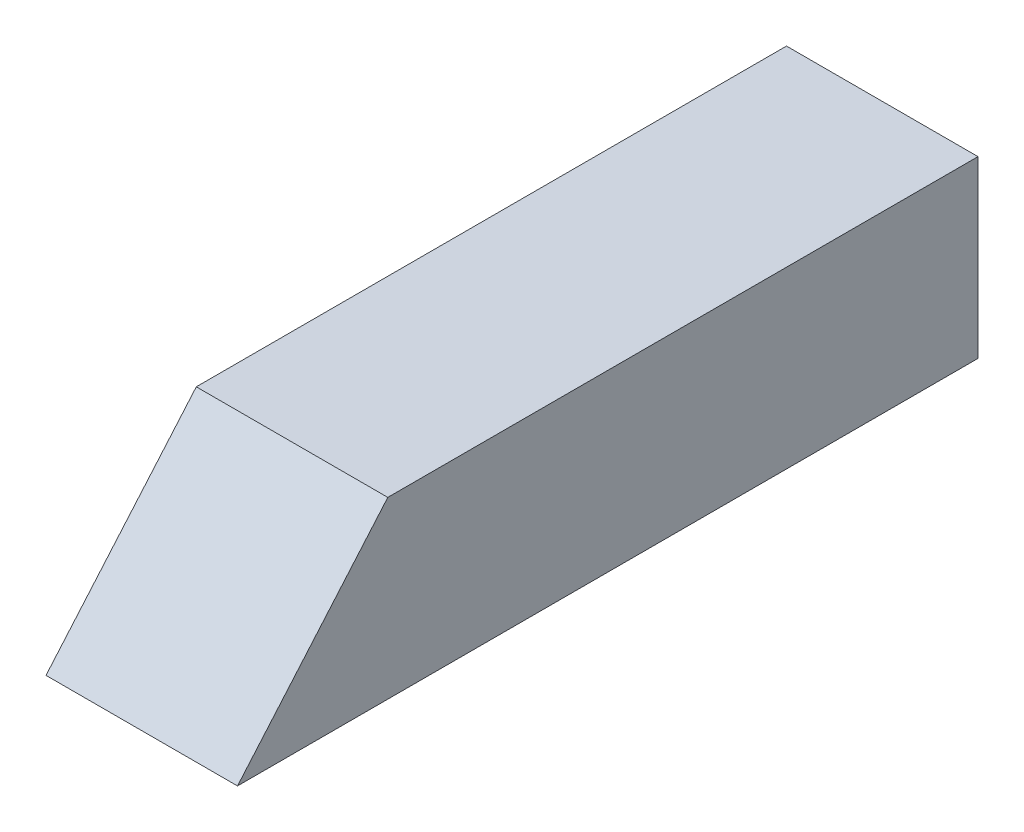
ISO-10303-21;
HEADER;
FILE_DESCRIPTION(('STEP AP214'),'2;1');
FILE_NAME('part.step','',(''),(''),'','','');
FILE_SCHEMA(('AUTOMOTIVE_DESIGN { 1 0 10303 214 1 1 1 1 }'));
ENDSEC;
DATA;
#1=APPLICATION_CONTEXT('core data for automotive mechanical design processes');
#2=APPLICATION_PROTOCOL_DEFINITION('international standard','automotive_design',2000,#1);
#3=PRODUCT_CONTEXT('',#1,'mechanical');
#4=PRODUCT('Part','Part','',(#3));
#5=PRODUCT_RELATED_PRODUCT_CATEGORY('part','',(#4));
#6=PRODUCT_DEFINITION_FORMATION('','',#4);
#7=PRODUCT_DEFINITION_CONTEXT('part definition',#1,'design');
#8=PRODUCT_DEFINITION('design','',#6,#7);
#9=PRODUCT_DEFINITION_SHAPE('','',#8);
#10=(LENGTH_UNIT() NAMED_UNIT(*) SI_UNIT(.MILLI.,.METRE.));
#11=(NAMED_UNIT(*) PLANE_ANGLE_UNIT() SI_UNIT($,.RADIAN.));
#12=(NAMED_UNIT(*) SI_UNIT($,.STERADIAN.) SOLID_ANGLE_UNIT());
#13=UNCERTAINTY_MEASURE_WITH_UNIT(LENGTH_MEASURE(1.E-05),#10,'distance_accuracy_value','');
#14=(GEOMETRIC_REPRESENTATION_CONTEXT(3) GLOBAL_UNCERTAINTY_ASSIGNED_CONTEXT((#13)) GLOBAL_UNIT_ASSIGNED_CONTEXT((#10,
#11,#12)) REPRESENTATION_CONTEXT('',''));
#15=CARTESIAN_POINT('',(0.,0.,0.));
#16=DIRECTION('',(0.,0.,1.));
#17=DIRECTION('',(1.,0.,0.));
#18=AXIS2_PLACEMENT_3D('',#15,#16,#17);
#19=CARTESIAN_POINT('',(0.,0.,170.));
#20=DIRECTION('',(1.,0.,0.));
#21=DIRECTION('',(0.,0.,-1.));
#22=AXIS2_PLACEMENT_3D('',#19,#20,#21);
#23=PLANE('',#22);
#24=DIRECTION('',(0.,0.,-1.));
#25=VECTOR('',#24,1.);
#26=CARTESIAN_POINT('',(0.,-40.1241169027451,170.));
#27=LINE('',#26,#25);
#28=CARTESIAN_POINT('',(0.,-40.1241169027451,170.));
#29=VERTEX_POINT('',#28);
#30=CARTESIAN_POINT('',(0.,-40.1241169027451,0.));
#31=VERTEX_POINT('',#30);
#32=EDGE_CURVE('E11',#29,#31,#27,.T.);
#33=ORIENTED_EDGE('',*,*,#32,.F.);
#34=DIRECTION('',(0.,0.758233405054984,-0.651983207957632));
#35=VECTOR('',#34,1.);
#36=CARTESIAN_POINT('',(0.,-40.1241169027451,170.));
#37=LINE('',#36,#35);
#38=CARTESIAN_POINT('',(0.,0.,135.498420037532));
#39=VERTEX_POINT('',#38);
#40=EDGE_CURVE('E48',#29,#39,#37,.T.);
#41=ORIENTED_EDGE('',*,*,#40,.T.);
#42=DIRECTION('',(0.,0.,-1.));
#43=VECTOR('',#42,1.);
#44=CARTESIAN_POINT('',(0.,0.,170.));
#45=LINE('',#44,#43);
#46=CARTESIAN_POINT('',(0.,0.,0.));
#47=VERTEX_POINT('',#46);
#48=EDGE_CURVE('E77',#39,#47,#45,.T.);
#49=ORIENTED_EDGE('',*,*,#48,.T.);
#50=DIRECTION('',(0.,-1.,0.));
#51=VECTOR('',#50,1.);
#52=CARTESIAN_POINT('',(0.,0.,0.));
#53=LINE('',#52,#51);
#54=EDGE_CURVE('E89',#47,#31,#53,.T.);
#55=ORIENTED_EDGE('',*,*,#54,.T.);
#56=EDGE_LOOP('',(#33,#41,#49,#55));
#57=FACE_BOUND('',#56,.T.);
#58=ADVANCED_FACE('F33',(#57),#23,.F.);
#59=CARTESIAN_POINT('',(0.,-40.1241169027451,170.));
#60=DIRECTION('',(0.,1.,0.));
#61=DIRECTION('',(0.,0.,1.));
#62=AXIS2_PLACEMENT_3D('',#59,#60,#61);
#63=PLANE('',#62);
#64=DIRECTION('',(1.,0.,0.));
#65=VECTOR('',#64,1.);
#66=CARTESIAN_POINT('',(0.,-40.1241169027451,0.));
#67=LINE('',#66,#65);
#68=CARTESIAN_POINT('',(43.9657876700292,-40.1241169027451,0.));
#69=VERTEX_POINT('',#68);
#70=EDGE_CURVE('E85',#31,#69,#67,.T.);
#71=ORIENTED_EDGE('',*,*,#70,.T.);
#72=DIRECTION('',(0.,0.,-1.));
#73=VECTOR('',#72,1.);
#74=CARTESIAN_POINT('',(43.9657876700292,-40.1241169027451,170.));
#75=LINE('',#74,#73);
#76=CARTESIAN_POINT('',(43.9657876700292,-40.1241169027451,170.));
#77=VERTEX_POINT('',#76);
#78=EDGE_CURVE('E41',#77,#69,#75,.T.);
#79=ORIENTED_EDGE('',*,*,#78,.F.);
#80=DIRECTION('',(1.,0.,0.));
#81=VECTOR('',#80,1.);
#82=CARTESIAN_POINT('',(0.,-40.1241169027451,170.));
#83=LINE('',#82,#81);
#84=EDGE_CURVE('E90',#29,#77,#83,.T.);
#85=ORIENTED_EDGE('',*,*,#84,.F.);
#86=ORIENTED_EDGE('',*,*,#32,.T.);
#87=EDGE_LOOP('',(#71,#79,#85,#86));
#88=FACE_BOUND('',#87,.T.);
#89=ADVANCED_FACE('F104',(#88),#63,.F.);
#90=CARTESIAN_POINT('',(43.9657876700292,0.,170.));
#91=DIRECTION('',(-1.,0.,0.));
#92=DIRECTION('',(0.,0.,1.));
#93=AXIS2_PLACEMENT_3D('',#90,#91,#92);
#94=PLANE('',#93);
#95=DIRECTION('',(0.,0.,-1.));
#96=VECTOR('',#95,1.);
#97=CARTESIAN_POINT('',(43.9657876700292,0.,170.));
#98=LINE('',#97,#96);
#99=CARTESIAN_POINT('',(43.9657876700292,0.,135.498420037532));
#100=VERTEX_POINT('',#99);
#101=CARTESIAN_POINT('',(43.9657876700292,0.,0.));
#102=VERTEX_POINT('',#101);
#103=EDGE_CURVE('E67',#100,#102,#98,.T.);
#104=ORIENTED_EDGE('',*,*,#103,.F.);
#105=DIRECTION('',(0.,0.758233405054984,-0.651983207957632));
#106=VECTOR('',#105,1.);
#107=CARTESIAN_POINT('',(43.9657876700292,-40.1241169027451,170.));
#108=LINE('',#107,#106);
#109=EDGE_CURVE('E101',#77,#100,#108,.T.);
#110=ORIENTED_EDGE('',*,*,#109,.F.);
#111=ORIENTED_EDGE('',*,*,#78,.T.);
#112=DIRECTION('',(0.,1.,0.));
#113=VECTOR('',#112,1.);
#114=CARTESIAN_POINT('',(43.9657876700292,0.,0.));
#115=LINE('',#114,#113);
#116=EDGE_CURVE('E81',#69,#102,#115,.T.);
#117=ORIENTED_EDGE('',*,*,#116,.T.);
#118=EDGE_LOOP('',(#104,#110,#111,#117));
#119=FACE_BOUND('',#118,.T.);
#120=ADVANCED_FACE('F82',(#119),#94,.F.);
#121=CARTESIAN_POINT('',(0.,0.,170.));
#122=DIRECTION('',(0.,-1.,0.));
#123=DIRECTION('',(0.,0.,-1.));
#124=AXIS2_PLACEMENT_3D('',#121,#122,#123);
#125=PLANE('',#124);
#126=ORIENTED_EDGE('',*,*,#48,.F.);
#127=DIRECTION('',(1.,0.,0.));
#128=VECTOR('',#127,1.);
#129=CARTESIAN_POINT('',(0.,0.,135.498420037532));
#130=LINE('',#129,#128);
#131=EDGE_CURVE('E74',#39,#100,#130,.T.);
#132=ORIENTED_EDGE('',*,*,#131,.T.);
#133=ORIENTED_EDGE('',*,*,#103,.T.);
#134=DIRECTION('',(-1.,0.,0.));
#135=VECTOR('',#134,1.);
#136=CARTESIAN_POINT('',(0.,0.,0.));
#137=LINE('',#136,#135);
#138=EDGE_CURVE('E72',#102,#47,#137,.T.);
#139=ORIENTED_EDGE('',*,*,#138,.T.);
#140=EDGE_LOOP('',(#126,#132,#133,#139));
#141=FACE_BOUND('',#140,.T.);
#142=ADVANCED_FACE('F70',(#141),#125,.F.);
#143=CARTESIAN_POINT('',(0.,0.,0.));
#144=DIRECTION('',(0.,0.,1.));
#145=DIRECTION('',(1.,0.,0.));
#146=AXIS2_PLACEMENT_3D('',#143,#144,#145);
#147=PLANE('',#146);
#148=ORIENTED_EDGE('',*,*,#54,.F.);
#149=ORIENTED_EDGE('',*,*,#138,.F.);
#150=ORIENTED_EDGE('',*,*,#116,.F.);
#151=ORIENTED_EDGE('',*,*,#70,.F.);
#152=EDGE_LOOP('',(#148,#149,#150,#151));
#153=FACE_BOUND('',#152,.T.);
#154=ADVANCED_FACE('F87',(#153),#147,.F.);
#155=CARTESIAN_POINT('',(0.,-40.1241169027451,170.));
#156=DIRECTION('',(0.,-0.651983207957631,-0.758233405054984));
#157=DIRECTION('',(0.,0.758233405054984,-0.651983207957632));
#158=AXIS2_PLACEMENT_3D('',#155,#156,#157);
#159=PLANE('',#158);
#160=ORIENTED_EDGE('',*,*,#109,.T.);
#161=ORIENTED_EDGE('',*,*,#131,.F.);
#162=ORIENTED_EDGE('',*,*,#40,.F.);
#163=ORIENTED_EDGE('',*,*,#84,.T.);
#164=EDGE_LOOP('',(#160,#161,#162,#163));
#165=FACE_BOUND('',#164,.T.);
#166=ADVANCED_FACE('F100',(#165),#159,.F.);
#167=CLOSED_SHELL('',(#58,#89,#120,#142,#154,#166));
#168=MANIFOLD_SOLID_BREP('B2',#167);
#169=ADVANCED_BREP_SHAPE_REPRESENTATION('',(#18,#168),#14);
#170=SHAPE_DEFINITION_REPRESENTATION(#9,#169);
ENDSEC;
END-ISO-10303-21;
